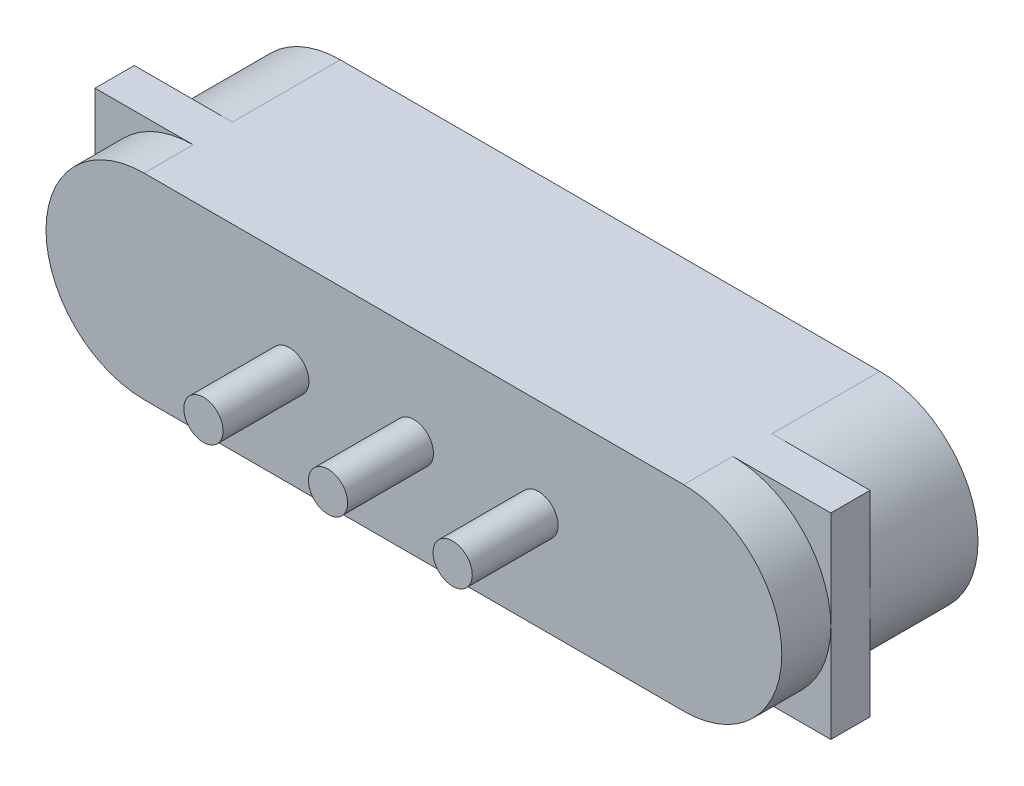
ISO-10303-21;
HEADER;
FILE_DESCRIPTION(('STEP AP214'),'2;1');
FILE_NAME('part.step','',(''),(''),'','','');
FILE_SCHEMA(('AUTOMOTIVE_DESIGN { 1 0 10303 214 1 1 1 1 }'));
ENDSEC;
DATA;
#1=APPLICATION_CONTEXT('core data for automotive mechanical design processes');
#2=APPLICATION_PROTOCOL_DEFINITION('international standard','automotive_design',2000,#1);
#3=PRODUCT_CONTEXT('',#1,'mechanical');
#4=PRODUCT('Part','Part','',(#3));
#5=PRODUCT_RELATED_PRODUCT_CATEGORY('part','',(#4));
#6=PRODUCT_DEFINITION_FORMATION('','',#4);
#7=PRODUCT_DEFINITION_CONTEXT('part definition',#1,'design');
#8=PRODUCT_DEFINITION('design','',#6,#7);
#9=PRODUCT_DEFINITION_SHAPE('','',#8);
#10=(LENGTH_UNIT() NAMED_UNIT(*) SI_UNIT(.MILLI.,.METRE.));
#11=(NAMED_UNIT(*) PLANE_ANGLE_UNIT() SI_UNIT($,.RADIAN.));
#12=(NAMED_UNIT(*) SI_UNIT($,.STERADIAN.) SOLID_ANGLE_UNIT());
#13=UNCERTAINTY_MEASURE_WITH_UNIT(LENGTH_MEASURE(1.E-05),#10,'distance_accuracy_value','');
#14=(GEOMETRIC_REPRESENTATION_CONTEXT(3) GLOBAL_UNCERTAINTY_ASSIGNED_CONTEXT((#13)) GLOBAL_UNIT_ASSIGNED_CONTEXT((#10,
#11,#12)) REPRESENTATION_CONTEXT('',''));
#15=CARTESIAN_POINT('',(0.,0.,0.));
#16=DIRECTION('',(0.,0.,1.));
#17=DIRECTION('',(1.,0.,0.));
#18=AXIS2_PLACEMENT_3D('',#15,#16,#17);
#19=CARTESIAN_POINT('',(0.,0.,4.));
#20=DIRECTION('',(0.,0.,-1.));
#21=DIRECTION('',(-1.,0.,0.));
#22=AXIS2_PLACEMENT_3D('',#19,#20,#21);
#23=CYLINDRICAL_SURFACE('',#22,2.);
#24=CARTESIAN_POINT('',(0.,0.,3.));
#25=DIRECTION('',(0.,0.,-1.));
#26=DIRECTION('',(-1.,0.,0.));
#27=AXIS2_PLACEMENT_3D('',#24,#25,#26);
#28=CIRCLE('',#27,2.);
#29=CARTESIAN_POINT('',(-2.,0.,3.));
#30=VERTEX_POINT('',#29);
#31=CARTESIAN_POINT('',(0.,2.,3.));
#32=VERTEX_POINT('',#31);
#33=EDGE_CURVE('E200',#30,#32,#28,.T.);
#34=ORIENTED_EDGE('',*,*,#33,.F.);
#35=CARTESIAN_POINT('',(0.,-2.,3.));
#36=VERTEX_POINT('',#35);
#37=EDGE_CURVE('E198',#36,#30,#28,.T.);
#38=ORIENTED_EDGE('',*,*,#37,.F.);
#39=DIRECTION('',(0.,0.,-1.));
#40=VECTOR('',#39,1.);
#41=CARTESIAN_POINT('',(0.,-2.,4.));
#42=LINE('',#41,#40);
#43=CARTESIAN_POINT('',(0.,-2.,4.));
#44=VERTEX_POINT('',#43);
#45=EDGE_CURVE('E11',#44,#36,#42,.T.);
#46=ORIENTED_EDGE('',*,*,#45,.F.);
#47=CARTESIAN_POINT('',(0.,0.,4.));
#48=DIRECTION('',(0.,0.,1.));
#49=DIRECTION('',(1.,0.,0.));
#50=AXIS2_PLACEMENT_3D('',#47,#48,#49);
#51=CIRCLE('',#50,2.);
#52=CARTESIAN_POINT('',(0.,2.,4.));
#53=VERTEX_POINT('',#52);
#54=EDGE_CURVE('E201',#53,#44,#51,.T.);
#55=ORIENTED_EDGE('',*,*,#54,.F.);
#56=DIRECTION('',(0.,0.,-1.));
#57=VECTOR('',#56,1.);
#58=CARTESIAN_POINT('',(0.,2.,4.));
#59=LINE('',#58,#57);
#60=EDGE_CURVE('E223',#53,#32,#59,.T.);
#61=ORIENTED_EDGE('',*,*,#60,.T.);
#62=EDGE_LOOP('',(#34,#38,#46,#55,#61));
#63=FACE_BOUND('',#62,.T.);
#64=ADVANCED_FACE('F33',(#63),#23,.T.);
#65=CARTESIAN_POINT('',(11.,0.,4.));
#66=DIRECTION('',(0.,0.,-1.));
#67=DIRECTION('',(-1.,0.,0.));
#68=AXIS2_PLACEMENT_3D('',#65,#66,#67);
#69=CYLINDRICAL_SURFACE('',#68,2.);
#70=CARTESIAN_POINT('',(11.,0.,3.));
#71=DIRECTION('',(0.,0.,-1.));
#72=DIRECTION('',(-1.,0.,0.));
#73=AXIS2_PLACEMENT_3D('',#70,#71,#72);
#74=CIRCLE('',#73,2.);
#75=CARTESIAN_POINT('',(11.,2.,3.));
#76=VERTEX_POINT('',#75);
#77=CARTESIAN_POINT('',(13.,0.,3.));
#78=VERTEX_POINT('',#77);
#79=EDGE_CURVE('E197',#76,#78,#74,.T.);
#80=ORIENTED_EDGE('',*,*,#79,.F.);
#81=DIRECTION('',(0.,0.,-1.));
#82=VECTOR('',#81,1.);
#83=CARTESIAN_POINT('',(11.,2.,4.));
#84=LINE('',#83,#82);
#85=CARTESIAN_POINT('',(11.,2.,4.));
#86=VERTEX_POINT('',#85);
#87=EDGE_CURVE('E227',#86,#76,#84,.T.);
#88=ORIENTED_EDGE('',*,*,#87,.F.);
#89=CARTESIAN_POINT('',(11.,0.,4.));
#90=DIRECTION('',(0.,0.,1.));
#91=DIRECTION('',(1.,0.,0.));
#92=AXIS2_PLACEMENT_3D('',#89,#90,#91);
#93=CIRCLE('',#92,2.);
#94=CARTESIAN_POINT('',(11.,-2.,4.));
#95=VERTEX_POINT('',#94);
#96=EDGE_CURVE('E207',#95,#86,#93,.T.);
#97=ORIENTED_EDGE('',*,*,#96,.F.);
#98=DIRECTION('',(0.,0.,-1.));
#99=VECTOR('',#98,1.);
#100=CARTESIAN_POINT('',(11.,-2.,4.));
#101=LINE('',#100,#99);
#102=CARTESIAN_POINT('',(11.,-2.,3.));
#103=VERTEX_POINT('',#102);
#104=EDGE_CURVE('E230',#95,#103,#101,.T.);
#105=ORIENTED_EDGE('',*,*,#104,.T.);
#106=EDGE_CURVE('E159',#78,#103,#74,.T.);
#107=ORIENTED_EDGE('',*,*,#106,.F.);
#108=EDGE_LOOP('',(#80,#88,#97,#105,#107));
#109=FACE_BOUND('',#108,.T.);
#110=ADVANCED_FACE('F327',(#109),#69,.T.);
#111=CARTESIAN_POINT('',(0.,0.,2.2));
#112=DIRECTION('',(0.,0.,-1.));
#113=DIRECTION('',(-1.,0.,0.));
#114=AXIS2_PLACEMENT_3D('',#111,#112,#113);
#115=CIRCLE('',#114,2.);
#116=CARTESIAN_POINT('',(0.,-2.,2.2));
#117=VERTEX_POINT('',#116);
#118=CARTESIAN_POINT('',(-2.,0.,2.2));
#119=VERTEX_POINT('',#118);
#120=EDGE_CURVE('E192',#117,#119,#115,.T.);
#121=ORIENTED_EDGE('',*,*,#120,.T.);
#122=CARTESIAN_POINT('',(0.,2.,2.2));
#123=VERTEX_POINT('',#122);
#124=EDGE_CURVE('E195',#119,#123,#115,.T.);
#125=ORIENTED_EDGE('',*,*,#124,.T.);
#126=CARTESIAN_POINT('',(0.,2.,0.));
#127=VERTEX_POINT('',#126);
#128=EDGE_CURVE('E211',#123,#127,#59,.T.);
#129=ORIENTED_EDGE('',*,*,#128,.T.);
#130=CARTESIAN_POINT('',(0.,0.,0.));
#131=DIRECTION('',(0.,0.,1.));
#132=DIRECTION('',(1.,0.,0.));
#133=AXIS2_PLACEMENT_3D('',#130,#131,#132);
#134=CIRCLE('',#133,2.);
#135=CARTESIAN_POINT('',(0.,-2.,0.));
#136=VERTEX_POINT('',#135);
#137=EDGE_CURVE('E212',#127,#136,#134,.T.);
#138=ORIENTED_EDGE('',*,*,#137,.T.);
#139=EDGE_CURVE('E41',#117,#136,#42,.T.);
#140=ORIENTED_EDGE('',*,*,#139,.F.);
#141=EDGE_LOOP('',(#121,#125,#129,#138,#140));
#142=FACE_BOUND('',#141,.T.);
#143=ADVANCED_FACE('F35',(#142),#23,.T.);
#144=CARTESIAN_POINT('',(0.,-2.,4.));
#145=DIRECTION('',(0.,1.,0.));
#146=DIRECTION('',(-1.,0.,0.));
#147=AXIS2_PLACEMENT_3D('',#144,#145,#146);
#148=PLANE('',#147);
#149=CARTESIAN_POINT('',(11.,-2.,2.2));
#150=VERTEX_POINT('',#149);
#151=CARTESIAN_POINT('',(11.,-2.,0.));
#152=VERTEX_POINT('',#151);
#153=EDGE_CURVE('E229',#150,#152,#101,.T.);
#154=ORIENTED_EDGE('',*,*,#153,.F.);
#155=DIRECTION('',(-1.,0.,0.));
#156=VECTOR('',#155,1.);
#157=CARTESIAN_POINT('',(13.,-2.,2.2));
#158=LINE('',#157,#156);
#159=CARTESIAN_POINT('',(13.,-2.,2.2));
#160=VERTEX_POINT('',#159);
#161=EDGE_CURVE('E56',#160,#150,#158,.T.);
#162=ORIENTED_EDGE('',*,*,#161,.F.);
#163=DIRECTION('',(0.,0.,-1.));
#164=VECTOR('',#163,1.);
#165=CARTESIAN_POINT('',(13.,-2.,3.));
#166=LINE('',#165,#164);
#167=CARTESIAN_POINT('',(13.,-2.,3.));
#168=VERTEX_POINT('',#167);
#169=EDGE_CURVE('E139',#168,#160,#166,.T.);
#170=ORIENTED_EDGE('',*,*,#169,.F.);
#171=DIRECTION('',(-1.,0.,0.));
#172=VECTOR('',#171,1.);
#173=CARTESIAN_POINT('',(13.,-2.,3.));
#174=LINE('',#173,#172);
#175=EDGE_CURVE('E153',#168,#103,#174,.T.);
#176=ORIENTED_EDGE('',*,*,#175,.T.);
#177=ORIENTED_EDGE('',*,*,#104,.F.);
#178=DIRECTION('',(1.,0.,0.));
#179=VECTOR('',#178,1.);
#180=CARTESIAN_POINT('',(0.,-2.,4.));
#181=LINE('',#180,#179);
#182=EDGE_CURVE('E204',#44,#95,#181,.T.);
#183=ORIENTED_EDGE('',*,*,#182,.F.);
#184=ORIENTED_EDGE('',*,*,#45,.T.);
#185=CARTESIAN_POINT('',(-2.,-2.,3.));
#186=VERTEX_POINT('',#185);
#187=EDGE_CURVE('E161',#36,#186,#174,.T.);
#188=ORIENTED_EDGE('',*,*,#187,.T.);
#189=DIRECTION('',(0.,0.,-1.));
#190=VECTOR('',#189,1.);
#191=CARTESIAN_POINT('',(-2.,-2.,3.));
#192=LINE('',#191,#190);
#193=CARTESIAN_POINT('',(-2.,-2.,2.2));
#194=VERTEX_POINT('',#193);
#195=EDGE_CURVE('E155',#186,#194,#192,.T.);
#196=ORIENTED_EDGE('',*,*,#195,.T.);
#197=EDGE_CURVE('E174',#117,#194,#158,.T.);
#198=ORIENTED_EDGE('',*,*,#197,.F.);
#199=ORIENTED_EDGE('',*,*,#139,.T.);
#200=DIRECTION('',(1.,0.,0.));
#201=VECTOR('',#200,1.);
#202=CARTESIAN_POINT('',(0.,-2.,0.));
#203=LINE('',#202,#201);
#204=EDGE_CURVE('E215',#136,#152,#203,.T.);
#205=ORIENTED_EDGE('',*,*,#204,.T.);
#206=EDGE_LOOP('',(#154,#162,#170,#176,#177,#183,#184,#188,#196,#198,#199,#205));
#207=FACE_BOUND('',#206,.T.);
#208=ADVANCED_FACE('F151',(#207),#148,.F.);
#209=CARTESIAN_POINT('',(11.,2.,2.2));
#210=VERTEX_POINT('',#209);
#211=CARTESIAN_POINT('',(11.,2.,0.));
#212=VERTEX_POINT('',#211);
#213=EDGE_CURVE('E226',#210,#212,#84,.T.);
#214=ORIENTED_EDGE('',*,*,#213,.F.);
#215=CARTESIAN_POINT('',(11.,0.,2.2));
#216=DIRECTION('',(0.,0.,-1.));
#217=DIRECTION('',(-1.,0.,0.));
#218=AXIS2_PLACEMENT_3D('',#215,#216,#217);
#219=CIRCLE('',#218,2.);
#220=CARTESIAN_POINT('',(13.,0.,2.2));
#221=VERTEX_POINT('',#220);
#222=EDGE_CURVE('E191',#210,#221,#219,.T.);
#223=ORIENTED_EDGE('',*,*,#222,.T.);
#224=EDGE_CURVE('E184',#221,#150,#219,.T.);
#225=ORIENTED_EDGE('',*,*,#224,.T.);
#226=ORIENTED_EDGE('',*,*,#153,.T.);
#227=CARTESIAN_POINT('',(11.,0.,0.));
#228=DIRECTION('',(0.,0.,1.));
#229=DIRECTION('',(1.,0.,0.));
#230=AXIS2_PLACEMENT_3D('',#227,#228,#229);
#231=CIRCLE('',#230,2.);
#232=EDGE_CURVE('E218',#152,#212,#231,.T.);
#233=ORIENTED_EDGE('',*,*,#232,.T.);
#234=EDGE_LOOP('',(#214,#223,#225,#226,#233));
#235=FACE_BOUND('',#234,.T.);
#236=ADVANCED_FACE('F235',(#235),#69,.T.);
#237=CARTESIAN_POINT('',(0.,2.,4.));
#238=DIRECTION('',(0.,-1.,0.));
#239=DIRECTION('',(1.,0.,0.));
#240=AXIS2_PLACEMENT_3D('',#237,#238,#239);
#241=PLANE('',#240);
#242=ORIENTED_EDGE('',*,*,#128,.F.);
#243=DIRECTION('',(1.,0.,0.));
#244=VECTOR('',#243,1.);
#245=CARTESIAN_POINT('',(13.,2.,2.2));
#246=LINE('',#245,#244);
#247=CARTESIAN_POINT('',(-2.,2.,2.2));
#248=VERTEX_POINT('',#247);
#249=EDGE_CURVE('E146',#248,#123,#246,.T.);
#250=ORIENTED_EDGE('',*,*,#249,.F.);
#251=DIRECTION('',(0.,0.,-1.));
#252=VECTOR('',#251,1.);
#253=CARTESIAN_POINT('',(-2.,2.,3.));
#254=LINE('',#253,#252);
#255=CARTESIAN_POINT('',(-2.,2.,3.));
#256=VERTEX_POINT('',#255);
#257=EDGE_CURVE('E185',#256,#248,#254,.T.);
#258=ORIENTED_EDGE('',*,*,#257,.F.);
#259=DIRECTION('',(1.,0.,0.));
#260=VECTOR('',#259,1.);
#261=CARTESIAN_POINT('',(13.,2.,3.));
#262=LINE('',#261,#260);
#263=EDGE_CURVE('E156',#256,#32,#262,.T.);
#264=ORIENTED_EDGE('',*,*,#263,.T.);
#265=ORIENTED_EDGE('',*,*,#60,.F.);
#266=DIRECTION('',(-1.,0.,0.));
#267=VECTOR('',#266,1.);
#268=CARTESIAN_POINT('',(0.,2.,4.));
#269=LINE('',#268,#267);
#270=EDGE_CURVE('E209',#86,#53,#269,.T.);
#271=ORIENTED_EDGE('',*,*,#270,.F.);
#272=ORIENTED_EDGE('',*,*,#87,.T.);
#273=CARTESIAN_POINT('',(13.,2.,3.));
#274=VERTEX_POINT('',#273);
#275=EDGE_CURVE('E168',#76,#274,#262,.T.);
#276=ORIENTED_EDGE('',*,*,#275,.T.);
#277=DIRECTION('',(0.,0.,-1.));
#278=VECTOR('',#277,1.);
#279=CARTESIAN_POINT('',(13.,2.,3.));
#280=LINE('',#279,#278);
#281=CARTESIAN_POINT('',(13.,2.,2.2));
#282=VERTEX_POINT('',#281);
#283=EDGE_CURVE('E181',#274,#282,#280,.T.);
#284=ORIENTED_EDGE('',*,*,#283,.T.);
#285=EDGE_CURVE('E179',#210,#282,#246,.T.);
#286=ORIENTED_EDGE('',*,*,#285,.F.);
#287=ORIENTED_EDGE('',*,*,#213,.T.);
#288=DIRECTION('',(-1.,0.,0.));
#289=VECTOR('',#288,1.);
#290=CARTESIAN_POINT('',(0.,2.,0.));
#291=LINE('',#290,#289);
#292=EDGE_CURVE('E205',#212,#127,#291,.T.);
#293=ORIENTED_EDGE('',*,*,#292,.T.);
#294=EDGE_LOOP('',(#242,#250,#258,#264,#265,#271,#272,#276,#284,#286,#287,#293));
#295=FACE_BOUND('',#294,.T.);
#296=ADVANCED_FACE('F247',(#295),#241,.F.);
#297=CARTESIAN_POINT('',(0.,0.,4.));
#298=DIRECTION('',(0.,0.,1.));
#299=DIRECTION('',(1.,0.,0.));
#300=AXIS2_PLACEMENT_3D('',#297,#298,#299);
#301=PLANE('',#300);
#302=CARTESIAN_POINT('',(2.96,0.,4.));
#303=DIRECTION('',(0.,0.,1.));
#304=DIRECTION('',(1.,0.,0.));
#305=AXIS2_PLACEMENT_3D('',#302,#303,#304);
#306=CIRCLE('',#305,0.4);
#307=CARTESIAN_POINT('',(3.36,0.,4.));
#308=VERTEX_POINT('',#307);
#309=EDGE_CURVE('E268',#308,#308,#306,.T.);
#310=ORIENTED_EDGE('',*,*,#309,.F.);
#311=EDGE_LOOP('',(#310));
#312=FACE_BOUND('',#311,.T.);
#313=CARTESIAN_POINT('',(8.04,0.,4.));
#314=DIRECTION('',(0.,0.,1.));
#315=DIRECTION('',(1.,0.,0.));
#316=AXIS2_PLACEMENT_3D('',#313,#314,#315);
#317=CIRCLE('',#316,0.400000000000001);
#318=CARTESIAN_POINT('',(8.44,0.,4.));
#319=VERTEX_POINT('',#318);
#320=EDGE_CURVE('E262',#319,#319,#317,.T.);
#321=ORIENTED_EDGE('',*,*,#320,.F.);
#322=EDGE_LOOP('',(#321));
#323=FACE_BOUND('',#322,.T.);
#324=CARTESIAN_POINT('',(5.5,0.,4.));
#325=DIRECTION('',(0.,0.,1.));
#326=DIRECTION('',(1.,0.,0.));
#327=AXIS2_PLACEMENT_3D('',#324,#325,#326);
#328=CIRCLE('',#327,0.400000000000001);
#329=CARTESIAN_POINT('',(5.9,0.,4.));
#330=VERTEX_POINT('',#329);
#331=EDGE_CURVE('E255',#330,#330,#328,.T.);
#332=ORIENTED_EDGE('',*,*,#331,.F.);
#333=EDGE_LOOP('',(#332));
#334=FACE_BOUND('',#333,.T.);
#335=ORIENTED_EDGE('',*,*,#54,.T.);
#336=ORIENTED_EDGE('',*,*,#182,.T.);
#337=ORIENTED_EDGE('',*,*,#96,.T.);
#338=ORIENTED_EDGE('',*,*,#270,.T.);
#339=EDGE_LOOP('',(#335,#336,#337,#338));
#340=FACE_BOUND('',#339,.T.);
#341=ADVANCED_FACE('F303',(#312,#323,#334,#340),#301,.T.);
#342=CARTESIAN_POINT('',(0.,0.,0.));
#343=DIRECTION('',(0.,0.,1.));
#344=DIRECTION('',(1.,0.,0.));
#345=AXIS2_PLACEMENT_3D('',#342,#343,#344);
#346=PLANE('',#345);
#347=CARTESIAN_POINT('',(8.04,0.,0.));
#348=DIRECTION('',(0.,0.,-1.));
#349=DIRECTION('',(-1.,0.,0.));
#350=AXIS2_PLACEMENT_3D('',#347,#348,#349);
#351=CIRCLE('',#350,0.500000000000002);
#352=CARTESIAN_POINT('',(7.54,0.,0.));
#353=VERTEX_POINT('',#352);
#354=EDGE_CURVE('E286',#353,#353,#351,.T.);
#355=ORIENTED_EDGE('',*,*,#354,.F.);
#356=EDGE_LOOP('',(#355));
#357=FACE_BOUND('',#356,.T.);
#358=CARTESIAN_POINT('',(2.96,0.,0.));
#359=DIRECTION('',(0.,0.,-1.));
#360=DIRECTION('',(-1.,0.,0.));
#361=AXIS2_PLACEMENT_3D('',#358,#359,#360);
#362=CIRCLE('',#361,0.5);
#363=CARTESIAN_POINT('',(2.46,0.,0.));
#364=VERTEX_POINT('',#363);
#365=EDGE_CURVE('E280',#364,#364,#362,.T.);
#366=ORIENTED_EDGE('',*,*,#365,.F.);
#367=EDGE_LOOP('',(#366));
#368=FACE_BOUND('',#367,.T.);
#369=CARTESIAN_POINT('',(5.5,0.,0.));
#370=DIRECTION('',(0.,0.,-1.));
#371=DIRECTION('',(-1.,0.,0.));
#372=AXIS2_PLACEMENT_3D('',#369,#370,#371);
#373=CIRCLE('',#372,0.500000000000002);
#374=CARTESIAN_POINT('',(5.,0.,0.));
#375=VERTEX_POINT('',#374);
#376=EDGE_CURVE('E274',#375,#375,#373,.T.);
#377=ORIENTED_EDGE('',*,*,#376,.F.);
#378=EDGE_LOOP('',(#377));
#379=FACE_BOUND('',#378,.T.);
#380=ORIENTED_EDGE('',*,*,#137,.F.);
#381=ORIENTED_EDGE('',*,*,#292,.F.);
#382=ORIENTED_EDGE('',*,*,#232,.F.);
#383=ORIENTED_EDGE('',*,*,#204,.F.);
#384=EDGE_LOOP('',(#380,#381,#382,#383));
#385=FACE_BOUND('',#384,.T.);
#386=ADVANCED_FACE('F244',(#357,#368,#379,#385),#346,.F.);
#387=CARTESIAN_POINT('',(13.,2.,3.));
#388=DIRECTION('',(1.,0.,0.));
#389=DIRECTION('',(0.,0.,-1.));
#390=AXIS2_PLACEMENT_3D('',#387,#388,#389);
#391=PLANE('',#390);
#392=DIRECTION('',(0.,-1.,0.));
#393=VECTOR('',#392,1.);
#394=CARTESIAN_POINT('',(13.,2.,2.2));
#395=LINE('',#394,#393);
#396=EDGE_CURVE('E175',#221,#160,#395,.T.);
#397=ORIENTED_EDGE('',*,*,#396,.F.);
#398=EDGE_CURVE('E171',#282,#221,#395,.T.);
#399=ORIENTED_EDGE('',*,*,#398,.F.);
#400=ORIENTED_EDGE('',*,*,#283,.F.);
#401=DIRECTION('',(0.,-1.,0.));
#402=VECTOR('',#401,1.);
#403=CARTESIAN_POINT('',(13.,2.,3.));
#404=LINE('',#403,#402);
#405=EDGE_CURVE('E142',#274,#78,#404,.T.);
#406=ORIENTED_EDGE('',*,*,#405,.T.);
#407=EDGE_CURVE('E135',#78,#168,#404,.T.);
#408=ORIENTED_EDGE('',*,*,#407,.T.);
#409=ORIENTED_EDGE('',*,*,#169,.T.);
#410=EDGE_LOOP('',(#397,#399,#400,#406,#408,#409));
#411=FACE_BOUND('',#410,.T.);
#412=ADVANCED_FACE('F138',(#411),#391,.T.);
#413=CARTESIAN_POINT('',(0.,0.,2.2));
#414=DIRECTION('',(0.,0.,-1.));
#415=DIRECTION('',(-1.,0.,0.));
#416=AXIS2_PLACEMENT_3D('',#413,#414,#415);
#417=PLANE('',#416);
#418=ORIENTED_EDGE('',*,*,#224,.F.);
#419=ORIENTED_EDGE('',*,*,#396,.T.);
#420=ORIENTED_EDGE('',*,*,#161,.T.);
#421=EDGE_LOOP('',(#418,#419,#420));
#422=FACE_BOUND('',#421,.T.);
#423=ADVANCED_FACE('F372',(#422),#417,.T.);
#424=CARTESIAN_POINT('',(0.,0.,3.));
#425=DIRECTION('',(0.,0.,-1.));
#426=DIRECTION('',(-1.,0.,0.));
#427=AXIS2_PLACEMENT_3D('',#424,#425,#426);
#428=PLANE('',#427);
#429=ORIENTED_EDGE('',*,*,#407,.F.);
#430=ORIENTED_EDGE('',*,*,#106,.T.);
#431=ORIENTED_EDGE('',*,*,#175,.F.);
#432=EDGE_LOOP('',(#429,#430,#431));
#433=FACE_BOUND('',#432,.T.);
#434=ADVANCED_FACE('F158',(#433),#428,.F.);
#435=ORIENTED_EDGE('',*,*,#222,.F.);
#436=ORIENTED_EDGE('',*,*,#285,.T.);
#437=ORIENTED_EDGE('',*,*,#398,.T.);
#438=EDGE_LOOP('',(#435,#436,#437));
#439=FACE_BOUND('',#438,.T.);
#440=ADVANCED_FACE('F251',(#439),#417,.T.);
#441=ORIENTED_EDGE('',*,*,#275,.F.);
#442=ORIENTED_EDGE('',*,*,#79,.T.);
#443=ORIENTED_EDGE('',*,*,#405,.F.);
#444=EDGE_LOOP('',(#441,#442,#443));
#445=FACE_BOUND('',#444,.T.);
#446=ADVANCED_FACE('F362',(#445),#428,.F.);
#447=CARTESIAN_POINT('',(-2.,2.,3.));
#448=DIRECTION('',(-1.,0.,0.));
#449=DIRECTION('',(0.,0.,1.));
#450=AXIS2_PLACEMENT_3D('',#447,#448,#449);
#451=PLANE('',#450);
#452=DIRECTION('',(0.,1.,0.));
#453=VECTOR('',#452,1.);
#454=CARTESIAN_POINT('',(-2.,2.,2.2));
#455=LINE('',#454,#453);
#456=EDGE_CURVE('E177',#119,#248,#455,.T.);
#457=ORIENTED_EDGE('',*,*,#456,.F.);
#458=EDGE_CURVE('E48',#194,#119,#455,.T.);
#459=ORIENTED_EDGE('',*,*,#458,.F.);
#460=ORIENTED_EDGE('',*,*,#195,.F.);
#461=DIRECTION('',(0.,1.,0.));
#462=VECTOR('',#461,1.);
#463=CARTESIAN_POINT('',(-2.,2.,3.));
#464=LINE('',#463,#462);
#465=EDGE_CURVE('E163',#186,#30,#464,.T.);
#466=ORIENTED_EDGE('',*,*,#465,.T.);
#467=EDGE_CURVE('E160',#30,#256,#464,.T.);
#468=ORIENTED_EDGE('',*,*,#467,.T.);
#469=ORIENTED_EDGE('',*,*,#257,.T.);
#470=EDGE_LOOP('',(#457,#459,#460,#466,#468,#469));
#471=FACE_BOUND('',#470,.T.);
#472=ADVANCED_FACE('F345',(#471),#451,.T.);
#473=ORIENTED_EDGE('',*,*,#467,.F.);
#474=ORIENTED_EDGE('',*,*,#33,.T.);
#475=ORIENTED_EDGE('',*,*,#263,.F.);
#476=EDGE_LOOP('',(#473,#474,#475));
#477=FACE_BOUND('',#476,.T.);
#478=ADVANCED_FACE('F353',(#477),#428,.F.);
#479=ORIENTED_EDGE('',*,*,#187,.F.);
#480=ORIENTED_EDGE('',*,*,#37,.T.);
#481=ORIENTED_EDGE('',*,*,#465,.F.);
#482=EDGE_LOOP('',(#479,#480,#481));
#483=FACE_BOUND('',#482,.T.);
#484=ADVANCED_FACE('F365',(#483),#428,.F.);
#485=ORIENTED_EDGE('',*,*,#124,.F.);
#486=ORIENTED_EDGE('',*,*,#456,.T.);
#487=ORIENTED_EDGE('',*,*,#249,.T.);
#488=EDGE_LOOP('',(#485,#486,#487));
#489=FACE_BOUND('',#488,.T.);
#490=ADVANCED_FACE('F348',(#489),#417,.T.);
#491=ORIENTED_EDGE('',*,*,#120,.F.);
#492=ORIENTED_EDGE('',*,*,#197,.T.);
#493=ORIENTED_EDGE('',*,*,#458,.T.);
#494=EDGE_LOOP('',(#491,#492,#493));
#495=FACE_BOUND('',#494,.T.);
#496=ADVANCED_FACE('F341',(#495),#417,.T.);
#497=CARTESIAN_POINT('',(5.5,0.,5.75));
#498=DIRECTION('',(0.,0.,-1.));
#499=DIRECTION('',(-1.,0.,0.));
#500=AXIS2_PLACEMENT_3D('',#497,#498,#499);
#501=CYLINDRICAL_SURFACE('',#500,0.400000000000001);
#502=CARTESIAN_POINT('',(5.5,0.,5.75));
#503=DIRECTION('',(0.,0.,1.));
#504=DIRECTION('',(1.,0.,0.));
#505=AXIS2_PLACEMENT_3D('',#502,#503,#504);
#506=CIRCLE('',#505,0.400000000000001);
#507=CARTESIAN_POINT('',(5.9,0.,5.75));
#508=VERTEX_POINT('',#507);
#509=EDGE_CURVE('E253',#508,#508,#506,.T.);
#510=ORIENTED_EDGE('',*,*,#509,.F.);
#511=EDGE_LOOP('',(#510));
#512=FACE_BOUND('',#511,.T.);
#513=ORIENTED_EDGE('',*,*,#331,.T.);
#514=EDGE_LOOP('',(#513));
#515=FACE_BOUND('',#514,.T.);
#516=ADVANCED_FACE('F485',(#512,#515),#501,.T.);
#517=CARTESIAN_POINT('',(5.5,0.,5.75));
#518=DIRECTION('',(0.,0.,1.));
#519=DIRECTION('',(1.,0.,0.));
#520=AXIS2_PLACEMENT_3D('',#517,#518,#519);
#521=PLANE('',#520);
#522=ORIENTED_EDGE('',*,*,#509,.T.);
#523=EDGE_LOOP('',(#522));
#524=FACE_BOUND('',#523,.T.);
#525=ADVANCED_FACE('F490',(#524),#521,.T.);
#526=CARTESIAN_POINT('',(8.04,0.,5.75));
#527=DIRECTION('',(0.,0.,-1.));
#528=DIRECTION('',(-1.,0.,0.));
#529=AXIS2_PLACEMENT_3D('',#526,#527,#528);
#530=CYLINDRICAL_SURFACE('',#529,0.400000000000001);
#531=CARTESIAN_POINT('',(8.04,0.,5.75));
#532=DIRECTION('',(0.,0.,1.));
#533=DIRECTION('',(1.,0.,0.));
#534=AXIS2_PLACEMENT_3D('',#531,#532,#533);
#535=CIRCLE('',#534,0.400000000000001);
#536=CARTESIAN_POINT('',(8.44,0.,5.75));
#537=VERTEX_POINT('',#536);
#538=EDGE_CURVE('E260',#537,#537,#535,.T.);
#539=ORIENTED_EDGE('',*,*,#538,.F.);
#540=EDGE_LOOP('',(#539));
#541=FACE_BOUND('',#540,.T.);
#542=ORIENTED_EDGE('',*,*,#320,.T.);
#543=EDGE_LOOP('',(#542));
#544=FACE_BOUND('',#543,.T.);
#545=ADVANCED_FACE('F499',(#541,#544),#530,.T.);
#546=CARTESIAN_POINT('',(8.04,0.,5.75));
#547=DIRECTION('',(0.,0.,1.));
#548=DIRECTION('',(1.,0.,0.));
#549=AXIS2_PLACEMENT_3D('',#546,#547,#548);
#550=PLANE('',#549);
#551=ORIENTED_EDGE('',*,*,#538,.T.);
#552=EDGE_LOOP('',(#551));
#553=FACE_BOUND('',#552,.T.);
#554=ADVANCED_FACE('F508',(#553),#550,.T.);
#555=CARTESIAN_POINT('',(2.96,0.,5.75));
#556=DIRECTION('',(0.,0.,-1.));
#557=DIRECTION('',(-1.,0.,0.));
#558=AXIS2_PLACEMENT_3D('',#555,#556,#557);
#559=CYLINDRICAL_SURFACE('',#558,0.4);
#560=CARTESIAN_POINT('',(2.96,0.,5.75));
#561=DIRECTION('',(0.,0.,1.));
#562=DIRECTION('',(1.,0.,0.));
#563=AXIS2_PLACEMENT_3D('',#560,#561,#562);
#564=CIRCLE('',#563,0.4);
#565=CARTESIAN_POINT('',(3.36,0.,5.75));
#566=VERTEX_POINT('',#565);
#567=EDGE_CURVE('E265',#566,#566,#564,.T.);
#568=ORIENTED_EDGE('',*,*,#567,.F.);
#569=EDGE_LOOP('',(#568));
#570=FACE_BOUND('',#569,.T.);
#571=ORIENTED_EDGE('',*,*,#309,.T.);
#572=EDGE_LOOP('',(#571));
#573=FACE_BOUND('',#572,.T.);
#574=ADVANCED_FACE('F322',(#570,#573),#559,.T.);
#575=CARTESIAN_POINT('',(2.96,0.,5.75));
#576=DIRECTION('',(0.,0.,1.));
#577=DIRECTION('',(1.,0.,0.));
#578=AXIS2_PLACEMENT_3D('',#575,#576,#577);
#579=PLANE('',#578);
#580=ORIENTED_EDGE('',*,*,#567,.T.);
#581=EDGE_LOOP('',(#580));
#582=FACE_BOUND('',#581,.T.);
#583=ADVANCED_FACE('F312',(#582),#579,.T.);
#584=CARTESIAN_POINT('',(5.5,0.,0.1));
#585=DIRECTION('',(0.,0.,-1.));
#586=DIRECTION('',(-1.,0.,0.));
#587=AXIS2_PLACEMENT_3D('',#584,#585,#586);
#588=CYLINDRICAL_SURFACE('',#587,0.500000000000002);
#589=CARTESIAN_POINT('',(5.5,0.,0.1));
#590=DIRECTION('',(0.,0.,-1.));
#591=DIRECTION('',(-1.,0.,0.));
#592=AXIS2_PLACEMENT_3D('',#589,#590,#591);
#593=CIRCLE('',#592,0.500000000000002);
#594=CARTESIAN_POINT('',(5.,0.,0.1));
#595=VERTEX_POINT('',#594);
#596=EDGE_CURVE('E277',#595,#595,#593,.T.);
#597=ORIENTED_EDGE('',*,*,#596,.F.);
#598=EDGE_LOOP('',(#597));
#599=FACE_BOUND('',#598,.T.);
#600=ORIENTED_EDGE('',*,*,#376,.T.);
#601=EDGE_LOOP('',(#600));
#602=FACE_BOUND('',#601,.T.);
#603=ADVANCED_FACE('F309',(#599,#602),#588,.F.);
#604=CARTESIAN_POINT('',(5.5,0.,0.1));
#605=DIRECTION('',(0.,0.,-1.));
#606=DIRECTION('',(-1.,0.,0.));
#607=AXIS2_PLACEMENT_3D('',#604,#605,#606);
#608=PLANE('',#607);
#609=ORIENTED_EDGE('',*,*,#596,.T.);
#610=EDGE_LOOP('',(#609));
#611=FACE_BOUND('',#610,.T.);
#612=ADVANCED_FACE('F311',(#611),#608,.T.);
#613=CARTESIAN_POINT('',(2.96,0.,0.1));
#614=DIRECTION('',(0.,0.,-1.));
#615=DIRECTION('',(-1.,0.,0.));
#616=AXIS2_PLACEMENT_3D('',#613,#614,#615);
#617=CYLINDRICAL_SURFACE('',#616,0.5);
#618=CARTESIAN_POINT('',(2.96,0.,0.1));
#619=DIRECTION('',(0.,0.,-1.));
#620=DIRECTION('',(-1.,0.,0.));
#621=AXIS2_PLACEMENT_3D('',#618,#619,#620);
#622=CIRCLE('',#621,0.5);
#623=CARTESIAN_POINT('',(2.46,0.,0.1));
#624=VERTEX_POINT('',#623);
#625=EDGE_CURVE('E283',#624,#624,#622,.T.);
#626=ORIENTED_EDGE('',*,*,#625,.F.);
#627=EDGE_LOOP('',(#626));
#628=FACE_BOUND('',#627,.T.);
#629=ORIENTED_EDGE('',*,*,#365,.T.);
#630=EDGE_LOOP('',(#629));
#631=FACE_BOUND('',#630,.T.);
#632=ADVANCED_FACE('F319',(#628,#631),#617,.F.);
#633=CARTESIAN_POINT('',(2.96,0.,0.1));
#634=DIRECTION('',(0.,0.,-1.));
#635=DIRECTION('',(-1.,0.,0.));
#636=AXIS2_PLACEMENT_3D('',#633,#634,#635);
#637=PLANE('',#636);
#638=ORIENTED_EDGE('',*,*,#625,.T.);
#639=EDGE_LOOP('',(#638));
#640=FACE_BOUND('',#639,.T.);
#641=ADVANCED_FACE('F297',(#640),#637,.T.);
#642=CARTESIAN_POINT('',(8.04,0.,0.1));
#643=DIRECTION('',(0.,0.,-1.));
#644=DIRECTION('',(-1.,0.,0.));
#645=AXIS2_PLACEMENT_3D('',#642,#643,#644);
#646=CYLINDRICAL_SURFACE('',#645,0.500000000000002);
#647=CARTESIAN_POINT('',(8.04,0.,0.1));
#648=DIRECTION('',(0.,0.,-1.));
#649=DIRECTION('',(-1.,0.,0.));
#650=AXIS2_PLACEMENT_3D('',#647,#648,#649);
#651=CIRCLE('',#650,0.500000000000002);
#652=CARTESIAN_POINT('',(7.54,0.,0.1));
#653=VERTEX_POINT('',#652);
#654=EDGE_CURVE('E271',#653,#653,#651,.T.);
#655=ORIENTED_EDGE('',*,*,#654,.F.);
#656=EDGE_LOOP('',(#655));
#657=FACE_BOUND('',#656,.T.);
#658=ORIENTED_EDGE('',*,*,#354,.T.);
#659=EDGE_LOOP('',(#658));
#660=FACE_BOUND('',#659,.T.);
#661=ADVANCED_FACE('F294',(#657,#660),#646,.F.);
#662=CARTESIAN_POINT('',(8.04,0.,0.1));
#663=DIRECTION('',(0.,0.,-1.));
#664=DIRECTION('',(-1.,0.,0.));
#665=AXIS2_PLACEMENT_3D('',#662,#663,#664);
#666=PLANE('',#665);
#667=ORIENTED_EDGE('',*,*,#654,.T.);
#668=EDGE_LOOP('',(#667));
#669=FACE_BOUND('',#668,.T.);
#670=ADVANCED_FACE('F292',(#669),#666,.T.);
#671=CLOSED_SHELL('',(#64,#110,#143,#208,#236,#296,#341,#386,#412,#423,#434,#440,#446,#472,#478,
#484,#490,#496,#516,#525,#545,#554,#574,#583,#603,#612,#632,#641,#661,#670));
#672=MANIFOLD_SOLID_BREP('B2',#671);
#673=ADVANCED_BREP_SHAPE_REPRESENTATION('',(#18,#672),#14);
#674=SHAPE_DEFINITION_REPRESENTATION(#9,#673);
ENDSEC;
END-ISO-10303-21;
